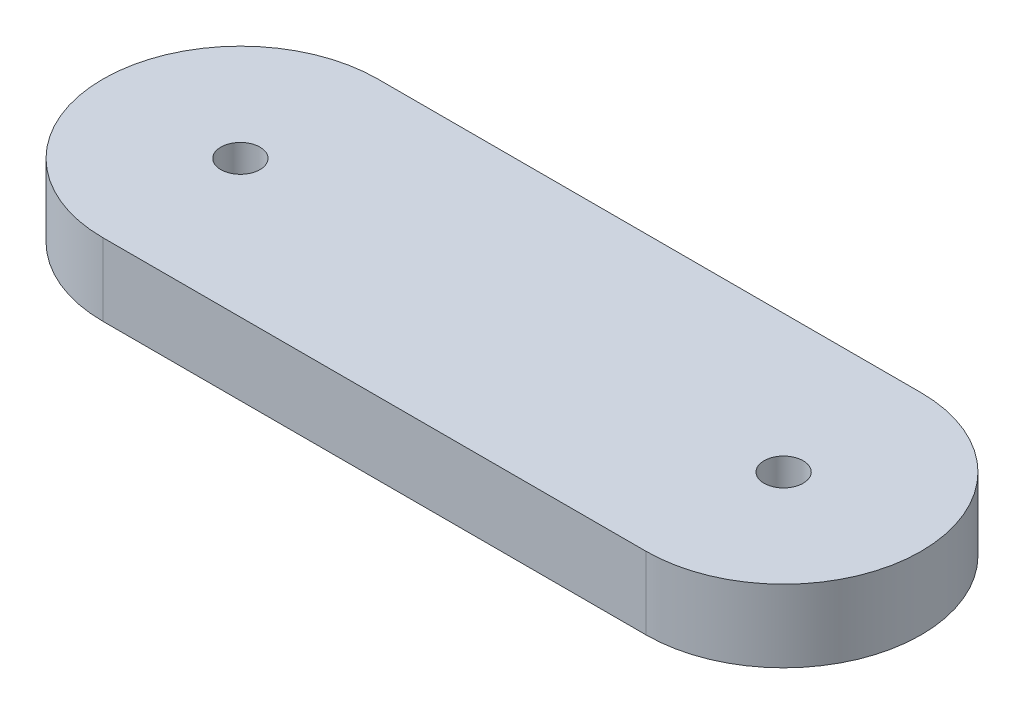
ISO-10303-21;
HEADER;
FILE_DESCRIPTION(('STEP AP214'),'2;1');
FILE_NAME('part.step','',(''),(''),'','','');
FILE_SCHEMA(('AUTOMOTIVE_DESIGN { 1 0 10303 214 1 1 1 1 }'));
ENDSEC;
DATA;
#1=APPLICATION_CONTEXT('core data for automotive mechanical design processes');
#2=APPLICATION_PROTOCOL_DEFINITION('international standard','automotive_design',2000,#1);
#3=PRODUCT_CONTEXT('',#1,'mechanical');
#4=PRODUCT('Part','Part','',(#3));
#5=PRODUCT_RELATED_PRODUCT_CATEGORY('part','',(#4));
#6=PRODUCT_DEFINITION_FORMATION('','',#4);
#7=PRODUCT_DEFINITION_CONTEXT('part definition',#1,'design');
#8=PRODUCT_DEFINITION('design','',#6,#7);
#9=PRODUCT_DEFINITION_SHAPE('','',#8);
#10=(LENGTH_UNIT() NAMED_UNIT(*) SI_UNIT(.MILLI.,.METRE.));
#11=(NAMED_UNIT(*) PLANE_ANGLE_UNIT() SI_UNIT($,.RADIAN.));
#12=(NAMED_UNIT(*) SI_UNIT($,.STERADIAN.) SOLID_ANGLE_UNIT());
#13=UNCERTAINTY_MEASURE_WITH_UNIT(LENGTH_MEASURE(1.E-05),#10,'distance_accuracy_value','');
#14=(GEOMETRIC_REPRESENTATION_CONTEXT(3) GLOBAL_UNCERTAINTY_ASSIGNED_CONTEXT((#13)) GLOBAL_UNIT_ASSIGNED_CONTEXT((#10,
#11,#12)) REPRESENTATION_CONTEXT('',''));
#15=CARTESIAN_POINT('',(0.,0.,0.));
#16=DIRECTION('',(0.,0.,1.));
#17=DIRECTION('',(1.,0.,0.));
#18=AXIS2_PLACEMENT_3D('',#15,#16,#17);
#19=CARTESIAN_POINT('',(0.,10.,18.9771784877971));
#20=DIRECTION('',(0.,0.,-1.));
#21=DIRECTION('',(-1.,0.,0.));
#22=AXIS2_PLACEMENT_3D('',#19,#20,#21);
#23=PLANE('',#22);
#24=DIRECTION('',(1.,0.,0.));
#25=VECTOR('',#24,1.);
#26=CARTESIAN_POINT('',(0.,0.,18.9771784877971));
#27=LINE('',#26,#25);
#28=CARTESIAN_POINT('',(0.,0.,18.9771784877971));
#29=VERTEX_POINT('',#28);
#30=CARTESIAN_POINT('',(75.,0.,18.9771784877971));
#31=VERTEX_POINT('',#30);
#32=EDGE_CURVE('E102',#29,#31,#27,.T.);
#33=ORIENTED_EDGE('',*,*,#32,.T.);
#34=DIRECTION('',(0.,-1.,0.));
#35=VECTOR('',#34,1.);
#36=CARTESIAN_POINT('',(75.,10.,18.9771784877971));
#37=LINE('',#36,#35);
#38=CARTESIAN_POINT('',(75.,10.,18.9771784877971));
#39=VERTEX_POINT('',#38);
#40=EDGE_CURVE('E11',#39,#31,#37,.T.);
#41=ORIENTED_EDGE('',*,*,#40,.F.);
#42=DIRECTION('',(1.,0.,0.));
#43=VECTOR('',#42,1.);
#44=CARTESIAN_POINT('',(0.,10.,18.9771784877971));
#45=LINE('',#44,#43);
#46=CARTESIAN_POINT('',(0.,10.,18.9771784877971));
#47=VERTEX_POINT('',#46);
#48=EDGE_CURVE('E81',#47,#39,#45,.T.);
#49=ORIENTED_EDGE('',*,*,#48,.F.);
#50=DIRECTION('',(0.,-1.,0.));
#51=VECTOR('',#50,1.);
#52=CARTESIAN_POINT('',(0.,10.,18.9771784877971));
#53=LINE('',#52,#51);
#54=EDGE_CURVE('E92',#47,#29,#53,.T.);
#55=ORIENTED_EDGE('',*,*,#54,.T.);
#56=EDGE_LOOP('',(#33,#41,#49,#55));
#57=FACE_BOUND('',#56,.T.);
#58=ADVANCED_FACE('F33',(#57),#23,.F.);
#59=CARTESIAN_POINT('',(75.,10.,0.));
#60=DIRECTION('',(0.,-1.,0.));
#61=DIRECTION('',(0.,0.,-1.));
#62=AXIS2_PLACEMENT_3D('',#59,#60,#61);
#63=CYLINDRICAL_SURFACE('',#62,18.9771784877971);
#64=CARTESIAN_POINT('',(75.,0.,0.));
#65=DIRECTION('',(0.,1.,0.));
#66=DIRECTION('',(0.,0.,1.));
#67=AXIS2_PLACEMENT_3D('',#64,#65,#66);
#68=CIRCLE('',#67,18.9771784877971);
#69=CARTESIAN_POINT('',(75.,0.,-18.9771784877971));
#70=VERTEX_POINT('',#69);
#71=EDGE_CURVE('E86',#31,#70,#68,.T.);
#72=ORIENTED_EDGE('',*,*,#71,.T.);
#73=DIRECTION('',(0.,-1.,0.));
#74=VECTOR('',#73,1.);
#75=CARTESIAN_POINT('',(75.,10.,-18.9771784877971));
#76=LINE('',#75,#74);
#77=CARTESIAN_POINT('',(75.,10.,-18.9771784877971));
#78=VERTEX_POINT('',#77);
#79=EDGE_CURVE('E42',#78,#70,#76,.T.);
#80=ORIENTED_EDGE('',*,*,#79,.F.);
#81=CARTESIAN_POINT('',(75.,10.,0.));
#82=DIRECTION('',(0.,1.,0.));
#83=DIRECTION('',(0.,0.,1.));
#84=AXIS2_PLACEMENT_3D('',#81,#82,#83);
#85=CIRCLE('',#84,18.9771784877971);
#86=EDGE_CURVE('E76',#39,#78,#85,.T.);
#87=ORIENTED_EDGE('',*,*,#86,.F.);
#88=ORIENTED_EDGE('',*,*,#40,.T.);
#89=EDGE_LOOP('',(#72,#80,#87,#88));
#90=FACE_BOUND('',#89,.T.);
#91=ADVANCED_FACE('F85',(#90),#63,.T.);
#92=CARTESIAN_POINT('',(0.,10.,-18.9771784877971));
#93=DIRECTION('',(0.,0.,-1.));
#94=DIRECTION('',(-1.,0.,0.));
#95=AXIS2_PLACEMENT_3D('',#92,#93,#94);
#96=PLANE('',#95);
#97=DIRECTION('',(1.,0.,0.));
#98=VECTOR('',#97,1.);
#99=CARTESIAN_POINT('',(0.,0.,-18.9771784877971));
#100=LINE('',#99,#98);
#101=CARTESIAN_POINT('',(0.,0.,-18.9771784877971));
#102=VERTEX_POINT('',#101);
#103=EDGE_CURVE('E106',#102,#70,#100,.T.);
#104=ORIENTED_EDGE('',*,*,#103,.F.);
#105=DIRECTION('',(0.,-1.,0.));
#106=VECTOR('',#105,1.);
#107=CARTESIAN_POINT('',(0.,10.,-18.9771784877971));
#108=LINE('',#107,#106);
#109=CARTESIAN_POINT('',(0.,10.,-18.9771784877971));
#110=VERTEX_POINT('',#109);
#111=EDGE_CURVE('E66',#110,#102,#108,.T.);
#112=ORIENTED_EDGE('',*,*,#111,.F.);
#113=DIRECTION('',(1.,0.,0.));
#114=VECTOR('',#113,1.);
#115=CARTESIAN_POINT('',(0.,10.,-18.9771784877971));
#116=LINE('',#115,#114);
#117=EDGE_CURVE('E79',#110,#78,#116,.T.);
#118=ORIENTED_EDGE('',*,*,#117,.T.);
#119=ORIENTED_EDGE('',*,*,#79,.T.);
#120=EDGE_LOOP('',(#104,#112,#118,#119));
#121=FACE_BOUND('',#120,.T.);
#122=ADVANCED_FACE('F90',(#121),#96,.T.);
#123=CARTESIAN_POINT('',(0.,10.,0.));
#124=DIRECTION('',(0.,-1.,0.));
#125=DIRECTION('',(0.,0.,-1.));
#126=AXIS2_PLACEMENT_3D('',#123,#124,#125);
#127=CYLINDRICAL_SURFACE('',#126,2.7);
#128=CARTESIAN_POINT('',(0.,10.,0.));
#129=DIRECTION('',(0.,1.,0.));
#130=DIRECTION('',(0.,0.,1.));
#131=AXIS2_PLACEMENT_3D('',#128,#129,#130);
#132=CIRCLE('',#131,2.7);
#133=CARTESIAN_POINT('',(0.,10.,2.7));
#134=VERTEX_POINT('',#133);
#135=EDGE_CURVE('E144',#134,#134,#132,.T.);
#136=ORIENTED_EDGE('',*,*,#135,.T.);
#137=EDGE_LOOP('',(#136));
#138=FACE_BOUND('',#137,.T.);
#139=CARTESIAN_POINT('',(0.,0.,0.));
#140=DIRECTION('',(0.,1.,0.));
#141=DIRECTION('',(0.,0.,1.));
#142=AXIS2_PLACEMENT_3D('',#139,#140,#141);
#143=CIRCLE('',#142,2.7);
#144=CARTESIAN_POINT('',(0.,0.,2.7));
#145=VERTEX_POINT('',#144);
#146=EDGE_CURVE('E99',#145,#145,#143,.T.);
#147=ORIENTED_EDGE('',*,*,#146,.F.);
#148=EDGE_LOOP('',(#147));
#149=FACE_BOUND('',#148,.T.);
#150=ADVANCED_FACE('F133',(#138,#149),#127,.F.);
#151=CARTESIAN_POINT('',(75.,10.,0.));
#152=DIRECTION('',(0.,-1.,0.));
#153=DIRECTION('',(0.,0.,-1.));
#154=AXIS2_PLACEMENT_3D('',#151,#152,#153);
#155=CYLINDRICAL_SURFACE('',#154,2.7);
#156=CARTESIAN_POINT('',(75.,10.,0.));
#157=DIRECTION('',(0.,1.,0.));
#158=DIRECTION('',(0.,0.,1.));
#159=AXIS2_PLACEMENT_3D('',#156,#157,#158);
#160=CIRCLE('',#159,2.7);
#161=CARTESIAN_POINT('',(75.,10.,2.7));
#162=VERTEX_POINT('',#161);
#163=EDGE_CURVE('E109',#162,#162,#160,.T.);
#164=ORIENTED_EDGE('',*,*,#163,.T.);
#165=EDGE_LOOP('',(#164));
#166=FACE_BOUND('',#165,.T.);
#167=CARTESIAN_POINT('',(75.,0.,0.));
#168=DIRECTION('',(0.,1.,0.));
#169=DIRECTION('',(0.,0.,1.));
#170=AXIS2_PLACEMENT_3D('',#167,#168,#169);
#171=CIRCLE('',#170,2.7);
#172=CARTESIAN_POINT('',(75.,0.,2.7));
#173=VERTEX_POINT('',#172);
#174=EDGE_CURVE('E96',#173,#173,#171,.T.);
#175=ORIENTED_EDGE('',*,*,#174,.F.);
#176=EDGE_LOOP('',(#175));
#177=FACE_BOUND('',#176,.T.);
#178=ADVANCED_FACE('F35',(#166,#177),#155,.F.);
#179=CARTESIAN_POINT('',(0.,10.,0.));
#180=DIRECTION('',(0.,-1.,0.));
#181=DIRECTION('',(0.,0.,-1.));
#182=AXIS2_PLACEMENT_3D('',#179,#180,#181);
#183=CYLINDRICAL_SURFACE('',#182,18.9771784877971);
#184=CARTESIAN_POINT('',(0.,0.,0.));
#185=DIRECTION('',(0.,1.,0.));
#186=DIRECTION('',(0.,0.,1.));
#187=AXIS2_PLACEMENT_3D('',#184,#185,#186);
#188=CIRCLE('',#187,18.9771784877971);
#189=EDGE_CURVE('E69',#102,#29,#188,.T.);
#190=ORIENTED_EDGE('',*,*,#189,.T.);
#191=ORIENTED_EDGE('',*,*,#54,.F.);
#192=CARTESIAN_POINT('',(0.,10.,0.));
#193=DIRECTION('',(0.,1.,0.));
#194=DIRECTION('',(0.,0.,1.));
#195=AXIS2_PLACEMENT_3D('',#192,#193,#194);
#196=CIRCLE('',#195,18.9771784877971);
#197=EDGE_CURVE('E50',#110,#47,#196,.T.);
#198=ORIENTED_EDGE('',*,*,#197,.F.);
#199=ORIENTED_EDGE('',*,*,#111,.T.);
#200=EDGE_LOOP('',(#190,#191,#198,#199));
#201=FACE_BOUND('',#200,.T.);
#202=ADVANCED_FACE('F121',(#201),#183,.T.);
#203=CARTESIAN_POINT('',(0.,10.,0.));
#204=DIRECTION('',(0.,1.,0.));
#205=DIRECTION('',(0.,0.,1.));
#206=AXIS2_PLACEMENT_3D('',#203,#204,#205);
#207=PLANE('',#206);
#208=ORIENTED_EDGE('',*,*,#163,.F.);
#209=EDGE_LOOP('',(#208));
#210=FACE_BOUND('',#209,.T.);
#211=ORIENTED_EDGE('',*,*,#135,.F.);
#212=EDGE_LOOP('',(#211));
#213=FACE_BOUND('',#212,.T.);
#214=ORIENTED_EDGE('',*,*,#48,.T.);
#215=ORIENTED_EDGE('',*,*,#86,.T.);
#216=ORIENTED_EDGE('',*,*,#117,.F.);
#217=ORIENTED_EDGE('',*,*,#197,.T.);
#218=EDGE_LOOP('',(#214,#215,#216,#217));
#219=FACE_BOUND('',#218,.T.);
#220=ADVANCED_FACE('F77',(#210,#213,#219),#207,.T.);
#221=CARTESIAN_POINT('',(0.,0.,0.));
#222=DIRECTION('',(0.,1.,0.));
#223=DIRECTION('',(0.,0.,1.));
#224=AXIS2_PLACEMENT_3D('',#221,#222,#223);
#225=PLANE('',#224);
#226=ORIENTED_EDGE('',*,*,#174,.T.);
#227=EDGE_LOOP('',(#226));
#228=FACE_BOUND('',#227,.T.);
#229=ORIENTED_EDGE('',*,*,#146,.T.);
#230=EDGE_LOOP('',(#229));
#231=FACE_BOUND('',#230,.T.);
#232=ORIENTED_EDGE('',*,*,#32,.F.);
#233=ORIENTED_EDGE('',*,*,#189,.F.);
#234=ORIENTED_EDGE('',*,*,#103,.T.);
#235=ORIENTED_EDGE('',*,*,#71,.F.);
#236=EDGE_LOOP('',(#232,#233,#234,#235));
#237=FACE_BOUND('',#236,.T.);
#238=ADVANCED_FACE('F114',(#228,#231,#237),#225,.F.);
#239=CLOSED_SHELL('',(#58,#91,#122,#150,#178,#202,#220,#238));
#240=MANIFOLD_SOLID_BREP('B2',#239);
#241=ADVANCED_BREP_SHAPE_REPRESENTATION('',(#18,#240),#14);
#242=SHAPE_DEFINITION_REPRESENTATION(#9,#241);
ENDSEC;
END-ISO-10303-21;
